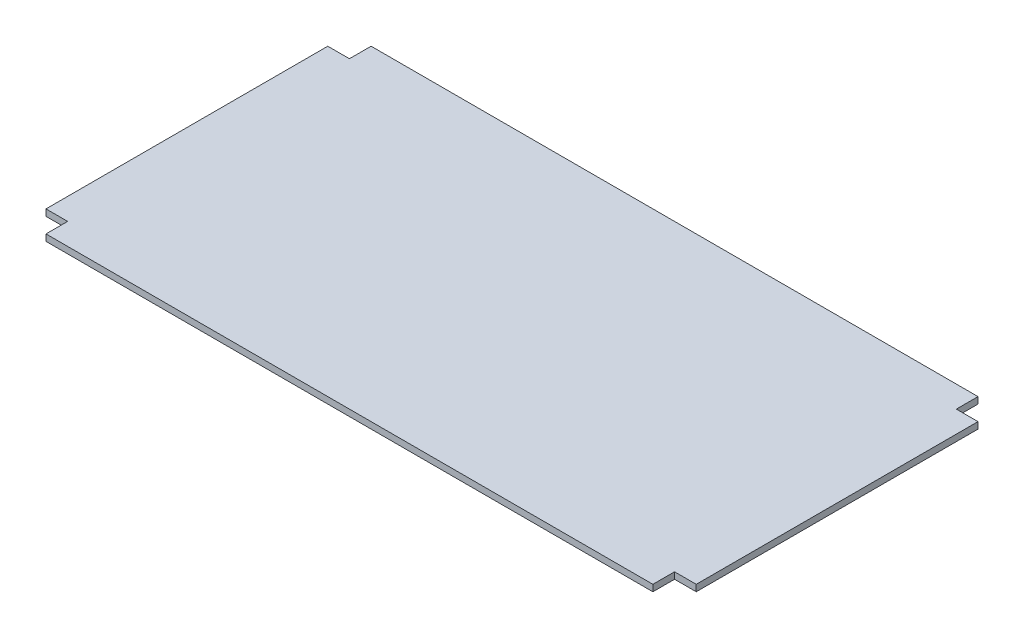
ISO-10303-21;
HEADER;
FILE_DESCRIPTION(('STEP AP214'),'2;1');
FILE_NAME('part.step','',(''),(''),'','','');
FILE_SCHEMA(('AUTOMOTIVE_DESIGN { 1 0 10303 214 1 1 1 1 }'));
ENDSEC;
DATA;
#1=APPLICATION_CONTEXT('core data for automotive mechanical design processes');
#2=APPLICATION_PROTOCOL_DEFINITION('international standard','automotive_design',2000,#1);
#3=PRODUCT_CONTEXT('',#1,'mechanical');
#4=PRODUCT('Part','Part','',(#3));
#5=PRODUCT_RELATED_PRODUCT_CATEGORY('part','',(#4));
#6=PRODUCT_DEFINITION_FORMATION('','',#4);
#7=PRODUCT_DEFINITION_CONTEXT('part definition',#1,'design');
#8=PRODUCT_DEFINITION('design','',#6,#7);
#9=PRODUCT_DEFINITION_SHAPE('','',#8);
#10=(LENGTH_UNIT() NAMED_UNIT(*) SI_UNIT(.MILLI.,.METRE.));
#11=(NAMED_UNIT(*) PLANE_ANGLE_UNIT() SI_UNIT($,.RADIAN.));
#12=(NAMED_UNIT(*) SI_UNIT($,.STERADIAN.) SOLID_ANGLE_UNIT());
#13=UNCERTAINTY_MEASURE_WITH_UNIT(LENGTH_MEASURE(1.E-05),#10,'distance_accuracy_value','');
#14=(GEOMETRIC_REPRESENTATION_CONTEXT(3) GLOBAL_UNCERTAINTY_ASSIGNED_CONTEXT((#13)) GLOBAL_UNIT_ASSIGNED_CONTEXT((#10,
#11,#12)) REPRESENTATION_CONTEXT('',''));
#15=CARTESIAN_POINT('',(0.,0.,0.));
#16=DIRECTION('',(0.,0.,1.));
#17=DIRECTION('',(1.,0.,0.));
#18=AXIS2_PLACEMENT_3D('',#15,#16,#17);
#19=CARTESIAN_POINT('',(0.,6.,0.));
#20=DIRECTION('',(1.,0.,0.));
#21=DIRECTION('',(0.,0.,-1.));
#22=AXIS2_PLACEMENT_3D('',#19,#20,#21);
#23=PLANE('',#22);
#24=DIRECTION('',(0.,0.,1.));
#25=VECTOR('',#24,1.);
#26=CARTESIAN_POINT('',(0.,6.,0.));
#27=LINE('',#26,#25);
#28=CARTESIAN_POINT('',(-9.60469719688014E-13,6.,-280.));
#29=VERTEX_POINT('',#28);
#30=CARTESIAN_POINT('',(0.,6.,-20.));
#31=VERTEX_POINT('',#30);
#32=EDGE_CURVE('E151',#29,#31,#27,.T.);
#33=ORIENTED_EDGE('',*,*,#32,.F.);
#34=DIRECTION('',(0.,1.,0.));
#35=VECTOR('',#34,1.);
#36=CARTESIAN_POINT('',(-9.60469719688014E-13,0.,-280.));
#37=LINE('',#36,#35);
#38=CARTESIAN_POINT('',(-9.60469719688014E-13,0.,-280.));
#39=VERTEX_POINT('',#38);
#40=EDGE_CURVE('E189',#39,#29,#37,.T.);
#41=ORIENTED_EDGE('',*,*,#40,.F.);
#42=DIRECTION('',(0.,0.,1.));
#43=VECTOR('',#42,1.);
#44=CARTESIAN_POINT('',(0.,0.,0.));
#45=LINE('',#44,#43);
#46=CARTESIAN_POINT('',(0.,0.,-20.));
#47=VERTEX_POINT('',#46);
#48=EDGE_CURVE('E153',#39,#47,#45,.T.);
#49=ORIENTED_EDGE('',*,*,#48,.T.);
#50=DIRECTION('',(0.,1.,0.));
#51=VECTOR('',#50,1.);
#52=CARTESIAN_POINT('',(0.,0.,-20.));
#53=LINE('',#52,#51);
#54=EDGE_CURVE('E157',#47,#31,#53,.T.);
#55=ORIENTED_EDGE('',*,*,#54,.T.);
#56=EDGE_LOOP('',(#33,#41,#49,#55));
#57=FACE_BOUND('',#56,.T.);
#58=ADVANCED_FACE('F38',(#57),#23,.F.);
#59=CARTESIAN_POINT('',(0.,6.,0.));
#60=DIRECTION('',(0.,0.,-1.));
#61=DIRECTION('',(-1.,0.,0.));
#62=AXIS2_PLACEMENT_3D('',#59,#60,#61);
#63=PLANE('',#62);
#64=DIRECTION('',(1.,0.,0.));
#65=VECTOR('',#64,1.);
#66=CARTESIAN_POINT('',(0.,0.,0.));
#67=LINE('',#66,#65);
#68=CARTESIAN_POINT('',(20.,0.,0.));
#69=VERTEX_POINT('',#68);
#70=CARTESIAN_POINT('',(580.,0.,0.));
#71=VERTEX_POINT('',#70);
#72=EDGE_CURVE('E149',#69,#71,#67,.T.);
#73=ORIENTED_EDGE('',*,*,#72,.T.);
#74=DIRECTION('',(0.,1.,0.));
#75=VECTOR('',#74,1.);
#76=CARTESIAN_POINT('',(580.,0.,0.));
#77=LINE('',#76,#75);
#78=CARTESIAN_POINT('',(580.,6.,0.));
#79=VERTEX_POINT('',#78);
#80=EDGE_CURVE('E178',#71,#79,#77,.T.);
#81=ORIENTED_EDGE('',*,*,#80,.T.);
#82=DIRECTION('',(1.,0.,0.));
#83=VECTOR('',#82,1.);
#84=CARTESIAN_POINT('',(0.,6.,0.));
#85=LINE('',#84,#83);
#86=CARTESIAN_POINT('',(20.,6.,0.));
#87=VERTEX_POINT('',#86);
#88=EDGE_CURVE('E160',#87,#79,#85,.T.);
#89=ORIENTED_EDGE('',*,*,#88,.F.);
#90=DIRECTION('',(0.,1.,0.));
#91=VECTOR('',#90,1.);
#92=CARTESIAN_POINT('',(20.,0.,0.));
#93=LINE('',#92,#91);
#94=EDGE_CURVE('E165',#69,#87,#93,.T.);
#95=ORIENTED_EDGE('',*,*,#94,.F.);
#96=EDGE_LOOP('',(#73,#81,#89,#95));
#97=FACE_BOUND('',#96,.T.);
#98=ADVANCED_FACE('F223',(#97),#63,.F.);
#99=CARTESIAN_POINT('',(600.,6.,0.));
#100=DIRECTION('',(-1.,0.,0.));
#101=DIRECTION('',(0.,0.,1.));
#102=AXIS2_PLACEMENT_3D('',#99,#100,#101);
#103=PLANE('',#102);
#104=DIRECTION('',(0.,0.,-1.));
#105=VECTOR('',#104,1.);
#106=CARTESIAN_POINT('',(600.,0.,0.));
#107=LINE('',#106,#105);
#108=CARTESIAN_POINT('',(600.,0.,-20.));
#109=VERTEX_POINT('',#108);
#110=CARTESIAN_POINT('',(599.999999999999,0.,-280.));
#111=VERTEX_POINT('',#110);
#112=EDGE_CURVE('E143',#109,#111,#107,.T.);
#113=ORIENTED_EDGE('',*,*,#112,.T.);
#114=DIRECTION('',(0.,1.,0.));
#115=VECTOR('',#114,1.);
#116=CARTESIAN_POINT('',(599.999999999999,0.,-280.));
#117=LINE('',#116,#115);
#118=CARTESIAN_POINT('',(599.999999999999,6.,-280.));
#119=VERTEX_POINT('',#118);
#120=EDGE_CURVE('E201',#111,#119,#117,.T.);
#121=ORIENTED_EDGE('',*,*,#120,.T.);
#122=DIRECTION('',(0.,0.,-1.));
#123=VECTOR('',#122,1.);
#124=CARTESIAN_POINT('',(600.,6.,0.));
#125=LINE('',#124,#123);
#126=CARTESIAN_POINT('',(600.,6.,-20.));
#127=VERTEX_POINT('',#126);
#128=EDGE_CURVE('E46',#127,#119,#125,.T.);
#129=ORIENTED_EDGE('',*,*,#128,.F.);
#130=DIRECTION('',(0.,1.,0.));
#131=VECTOR('',#130,1.);
#132=CARTESIAN_POINT('',(600.,0.,-20.));
#133=LINE('',#132,#131);
#134=EDGE_CURVE('E131',#109,#127,#133,.T.);
#135=ORIENTED_EDGE('',*,*,#134,.F.);
#136=EDGE_LOOP('',(#113,#121,#129,#135));
#137=FACE_BOUND('',#136,.T.);
#138=ADVANCED_FACE('F141',(#137),#103,.F.);
#139=CARTESIAN_POINT('',(0.,6.,-300.));
#140=DIRECTION('',(0.,0.,1.));
#141=DIRECTION('',(1.,0.,0.));
#142=AXIS2_PLACEMENT_3D('',#139,#140,#141);
#143=PLANE('',#142);
#144=DIRECTION('',(-1.,0.,0.));
#145=VECTOR('',#144,1.);
#146=CARTESIAN_POINT('',(0.,0.,-300.));
#147=LINE('',#146,#145);
#148=CARTESIAN_POINT('',(579.999999999999,0.,-300.));
#149=VERTEX_POINT('',#148);
#150=CARTESIAN_POINT('',(19.999999999999,0.,-300.));
#151=VERTEX_POINT('',#150);
#152=EDGE_CURVE('E41',#149,#151,#147,.T.);
#153=ORIENTED_EDGE('',*,*,#152,.T.);
#154=DIRECTION('',(0.,1.,0.));
#155=VECTOR('',#154,1.);
#156=CARTESIAN_POINT('',(19.999999999999,0.,-300.));
#157=LINE('',#156,#155);
#158=CARTESIAN_POINT('',(19.999999999999,6.,-300.));
#159=VERTEX_POINT('',#158);
#160=EDGE_CURVE('E185',#151,#159,#157,.T.);
#161=ORIENTED_EDGE('',*,*,#160,.T.);
#162=DIRECTION('',(-1.,0.,0.));
#163=VECTOR('',#162,1.);
#164=CARTESIAN_POINT('',(0.,6.,-300.));
#165=LINE('',#164,#163);
#166=CARTESIAN_POINT('',(579.999999999999,6.,-300.));
#167=VERTEX_POINT('',#166);
#168=EDGE_CURVE('E11',#167,#159,#165,.T.);
#169=ORIENTED_EDGE('',*,*,#168,.F.);
#170=DIRECTION('',(0.,1.,0.));
#171=VECTOR('',#170,1.);
#172=CARTESIAN_POINT('',(579.999999999999,0.,-300.));
#173=LINE('',#172,#171);
#174=EDGE_CURVE('E203',#149,#167,#173,.T.);
#175=ORIENTED_EDGE('',*,*,#174,.F.);
#176=EDGE_LOOP('',(#153,#161,#169,#175));
#177=FACE_BOUND('',#176,.T.);
#178=ADVANCED_FACE('F249',(#177),#143,.F.);
#179=CARTESIAN_POINT('',(0.,6.,0.));
#180=DIRECTION('',(0.,-1.,0.));
#181=DIRECTION('',(0.,0.,-1.));
#182=AXIS2_PLACEMENT_3D('',#179,#180,#181);
#183=PLANE('',#182);
#184=DIRECTION('',(0.,0.,-1.));
#185=VECTOR('',#184,1.);
#186=CARTESIAN_POINT('',(19.9999999999991,6.,-280.));
#187=LINE('',#186,#185);
#188=CARTESIAN_POINT('',(19.9999999999991,6.,-280.));
#189=VERTEX_POINT('',#188);
#190=EDGE_CURVE('E192',#189,#159,#187,.T.);
#191=ORIENTED_EDGE('',*,*,#190,.F.);
#192=DIRECTION('',(1.,0.,0.));
#193=VECTOR('',#192,1.);
#194=CARTESIAN_POINT('',(-9.60469719688014E-13,6.,-280.));
#195=LINE('',#194,#193);
#196=EDGE_CURVE('E195',#29,#189,#195,.T.);
#197=ORIENTED_EDGE('',*,*,#196,.F.);
#198=ORIENTED_EDGE('',*,*,#32,.T.);
#199=DIRECTION('',(-1.,0.,0.));
#200=VECTOR('',#199,1.);
#201=CARTESIAN_POINT('',(0.,6.,-20.));
#202=LINE('',#201,#200);
#203=CARTESIAN_POINT('',(20.,6.,-20.));
#204=VERTEX_POINT('',#203);
#205=EDGE_CURVE('E172',#204,#31,#202,.T.);
#206=ORIENTED_EDGE('',*,*,#205,.F.);
#207=DIRECTION('',(0.,0.,-1.));
#208=VECTOR('',#207,1.);
#209=CARTESIAN_POINT('',(20.,6.,0.));
#210=LINE('',#209,#208);
#211=EDGE_CURVE('E175',#87,#204,#210,.T.);
#212=ORIENTED_EDGE('',*,*,#211,.F.);
#213=ORIENTED_EDGE('',*,*,#88,.T.);
#214=DIRECTION('',(0.,0.,1.));
#215=VECTOR('',#214,1.);
#216=CARTESIAN_POINT('',(580.,6.,0.));
#217=LINE('',#216,#215);
#218=CARTESIAN_POINT('',(580.,6.,-20.));
#219=VERTEX_POINT('',#218);
#220=EDGE_CURVE('E136',#219,#79,#217,.T.);
#221=ORIENTED_EDGE('',*,*,#220,.F.);
#222=DIRECTION('',(-1.,0.,0.));
#223=VECTOR('',#222,1.);
#224=CARTESIAN_POINT('',(580.,6.,-20.));
#225=LINE('',#224,#223);
#226=EDGE_CURVE('E208',#127,#219,#225,.T.);
#227=ORIENTED_EDGE('',*,*,#226,.F.);
#228=ORIENTED_EDGE('',*,*,#128,.T.);
#229=DIRECTION('',(1.,0.,0.));
#230=VECTOR('',#229,1.);
#231=CARTESIAN_POINT('',(579.999999999999,6.,-280.));
#232=LINE('',#231,#230);
#233=CARTESIAN_POINT('',(579.999999999999,6.,-280.));
#234=VERTEX_POINT('',#233);
#235=EDGE_CURVE('E191',#234,#119,#232,.T.);
#236=ORIENTED_EDGE('',*,*,#235,.F.);
#237=DIRECTION('',(0.,0.,1.));
#238=VECTOR('',#237,1.);
#239=CARTESIAN_POINT('',(579.999999999999,6.,-280.));
#240=LINE('',#239,#238);
#241=EDGE_CURVE('E209',#167,#234,#240,.T.);
#242=ORIENTED_EDGE('',*,*,#241,.F.);
#243=ORIENTED_EDGE('',*,*,#168,.T.);
#244=EDGE_LOOP('',(#191,#197,#198,#206,#212,#213,#221,#227,#228,#236,#242,#243));
#245=FACE_BOUND('',#244,.T.);
#246=ADVANCED_FACE('F232',(#245),#183,.F.);
#247=CARTESIAN_POINT('',(0.,0.,0.));
#248=DIRECTION('',(0.,-1.,0.));
#249=DIRECTION('',(0.,0.,-1.));
#250=AXIS2_PLACEMENT_3D('',#247,#248,#249);
#251=PLANE('',#250);
#252=DIRECTION('',(1.,0.,0.));
#253=VECTOR('',#252,1.);
#254=CARTESIAN_POINT('',(-9.60469719688014E-13,0.,-280.));
#255=LINE('',#254,#253);
#256=CARTESIAN_POINT('',(19.9999999999991,0.,-280.));
#257=VERTEX_POINT('',#256);
#258=EDGE_CURVE('E194',#39,#257,#255,.T.);
#259=ORIENTED_EDGE('',*,*,#258,.T.);
#260=DIRECTION('',(0.,0.,-1.));
#261=VECTOR('',#260,1.);
#262=CARTESIAN_POINT('',(19.9999999999991,0.,-280.));
#263=LINE('',#262,#261);
#264=EDGE_CURVE('E186',#257,#151,#263,.T.);
#265=ORIENTED_EDGE('',*,*,#264,.T.);
#266=ORIENTED_EDGE('',*,*,#152,.F.);
#267=DIRECTION('',(0.,0.,1.));
#268=VECTOR('',#267,1.);
#269=CARTESIAN_POINT('',(579.999999999999,0.,-280.));
#270=LINE('',#269,#268);
#271=CARTESIAN_POINT('',(579.999999999999,0.,-280.));
#272=VERTEX_POINT('',#271);
#273=EDGE_CURVE('E204',#149,#272,#270,.T.);
#274=ORIENTED_EDGE('',*,*,#273,.T.);
#275=DIRECTION('',(1.,0.,0.));
#276=VECTOR('',#275,1.);
#277=CARTESIAN_POINT('',(579.999999999999,0.,-280.));
#278=LINE('',#277,#276);
#279=EDGE_CURVE('E54',#272,#111,#278,.T.);
#280=ORIENTED_EDGE('',*,*,#279,.T.);
#281=ORIENTED_EDGE('',*,*,#112,.F.);
#282=DIRECTION('',(-1.,0.,0.));
#283=VECTOR('',#282,1.);
#284=CARTESIAN_POINT('',(580.,0.,-20.));
#285=LINE('',#284,#283);
#286=CARTESIAN_POINT('',(580.,0.,-20.));
#287=VERTEX_POINT('',#286);
#288=EDGE_CURVE('E127',#109,#287,#285,.T.);
#289=ORIENTED_EDGE('',*,*,#288,.T.);
#290=DIRECTION('',(0.,0.,1.));
#291=VECTOR('',#290,1.);
#292=CARTESIAN_POINT('',(580.,0.,0.));
#293=LINE('',#292,#291);
#294=EDGE_CURVE('E62',#287,#71,#293,.T.);
#295=ORIENTED_EDGE('',*,*,#294,.T.);
#296=ORIENTED_EDGE('',*,*,#72,.F.);
#297=DIRECTION('',(0.,0.,-1.));
#298=VECTOR('',#297,1.);
#299=CARTESIAN_POINT('',(20.,0.,0.));
#300=LINE('',#299,#298);
#301=CARTESIAN_POINT('',(20.,0.,-20.));
#302=VERTEX_POINT('',#301);
#303=EDGE_CURVE('E174',#69,#302,#300,.T.);
#304=ORIENTED_EDGE('',*,*,#303,.T.);
#305=DIRECTION('',(-1.,0.,0.));
#306=VECTOR('',#305,1.);
#307=CARTESIAN_POINT('',(0.,0.,-20.));
#308=LINE('',#307,#306);
#309=EDGE_CURVE('E168',#302,#47,#308,.T.);
#310=ORIENTED_EDGE('',*,*,#309,.T.);
#311=ORIENTED_EDGE('',*,*,#48,.F.);
#312=EDGE_LOOP('',(#259,#265,#266,#274,#280,#281,#289,#295,#296,#304,#310,#311));
#313=FACE_BOUND('',#312,.T.);
#314=ADVANCED_FACE('F147',(#313),#251,.T.);
#315=CARTESIAN_POINT('',(0.,0.,-20.));
#316=DIRECTION('',(0.,0.,-1.));
#317=DIRECTION('',(-1.,0.,0.));
#318=AXIS2_PLACEMENT_3D('',#315,#316,#317);
#319=PLANE('',#318);
#320=ORIENTED_EDGE('',*,*,#205,.T.);
#321=ORIENTED_EDGE('',*,*,#54,.F.);
#322=ORIENTED_EDGE('',*,*,#309,.F.);
#323=DIRECTION('',(0.,1.,0.));
#324=VECTOR('',#323,1.);
#325=CARTESIAN_POINT('',(20.,0.,-20.));
#326=LINE('',#325,#324);
#327=EDGE_CURVE('E167',#302,#204,#326,.T.);
#328=ORIENTED_EDGE('',*,*,#327,.T.);
#329=EDGE_LOOP('',(#320,#321,#322,#328));
#330=FACE_BOUND('',#329,.T.);
#331=ADVANCED_FACE('F237',(#330),#319,.F.);
#332=CARTESIAN_POINT('',(20.,0.,0.));
#333=DIRECTION('',(1.,0.,0.));
#334=DIRECTION('',(0.,0.,-1.));
#335=AXIS2_PLACEMENT_3D('',#332,#333,#334);
#336=PLANE('',#335);
#337=ORIENTED_EDGE('',*,*,#211,.T.);
#338=ORIENTED_EDGE('',*,*,#327,.F.);
#339=ORIENTED_EDGE('',*,*,#303,.F.);
#340=ORIENTED_EDGE('',*,*,#94,.T.);
#341=EDGE_LOOP('',(#337,#338,#339,#340));
#342=FACE_BOUND('',#341,.T.);
#343=ADVANCED_FACE('F227',(#342),#336,.F.);
#344=CARTESIAN_POINT('',(580.,0.,0.));
#345=DIRECTION('',(-1.,0.,0.));
#346=DIRECTION('',(0.,0.,1.));
#347=AXIS2_PLACEMENT_3D('',#344,#345,#346);
#348=PLANE('',#347);
#349=ORIENTED_EDGE('',*,*,#220,.T.);
#350=ORIENTED_EDGE('',*,*,#80,.F.);
#351=ORIENTED_EDGE('',*,*,#294,.F.);
#352=DIRECTION('',(0.,1.,0.));
#353=VECTOR('',#352,1.);
#354=CARTESIAN_POINT('',(580.,0.,-20.));
#355=LINE('',#354,#353);
#356=EDGE_CURVE('E133',#287,#219,#355,.T.);
#357=ORIENTED_EDGE('',*,*,#356,.T.);
#358=EDGE_LOOP('',(#349,#350,#351,#357));
#359=FACE_BOUND('',#358,.T.);
#360=ADVANCED_FACE('F256',(#359),#348,.F.);
#361=CARTESIAN_POINT('',(580.,0.,-20.));
#362=DIRECTION('',(0.,0.,-1.));
#363=DIRECTION('',(-1.,0.,0.));
#364=AXIS2_PLACEMENT_3D('',#361,#362,#363);
#365=PLANE('',#364);
#366=ORIENTED_EDGE('',*,*,#226,.T.);
#367=ORIENTED_EDGE('',*,*,#356,.F.);
#368=ORIENTED_EDGE('',*,*,#288,.F.);
#369=ORIENTED_EDGE('',*,*,#134,.T.);
#370=EDGE_LOOP('',(#366,#367,#368,#369));
#371=FACE_BOUND('',#370,.T.);
#372=ADVANCED_FACE('F130',(#371),#365,.F.);
#373=CARTESIAN_POINT('',(579.999999999999,0.,-280.));
#374=DIRECTION('',(0.,0.,1.));
#375=DIRECTION('',(1.,0.,0.));
#376=AXIS2_PLACEMENT_3D('',#373,#374,#375);
#377=PLANE('',#376);
#378=ORIENTED_EDGE('',*,*,#235,.T.);
#379=ORIENTED_EDGE('',*,*,#120,.F.);
#380=ORIENTED_EDGE('',*,*,#279,.F.);
#381=DIRECTION('',(0.,1.,0.));
#382=VECTOR('',#381,1.);
#383=CARTESIAN_POINT('',(579.999999999999,0.,-280.));
#384=LINE('',#383,#382);
#385=EDGE_CURVE('E206',#272,#234,#384,.T.);
#386=ORIENTED_EDGE('',*,*,#385,.T.);
#387=EDGE_LOOP('',(#378,#379,#380,#386));
#388=FACE_BOUND('',#387,.T.);
#389=ADVANCED_FACE('F255',(#388),#377,.F.);
#390=CARTESIAN_POINT('',(579.999999999999,0.,-280.));
#391=DIRECTION('',(-1.,0.,0.));
#392=DIRECTION('',(0.,0.,1.));
#393=AXIS2_PLACEMENT_3D('',#390,#391,#392);
#394=PLANE('',#393);
#395=ORIENTED_EDGE('',*,*,#241,.T.);
#396=ORIENTED_EDGE('',*,*,#385,.F.);
#397=ORIENTED_EDGE('',*,*,#273,.F.);
#398=ORIENTED_EDGE('',*,*,#174,.T.);
#399=EDGE_LOOP('',(#395,#396,#397,#398));
#400=FACE_BOUND('',#399,.T.);
#401=ADVANCED_FACE('F254',(#400),#394,.F.);
#402=CARTESIAN_POINT('',(-9.60469719688014E-13,0.,-280.));
#403=DIRECTION('',(0.,0.,1.));
#404=DIRECTION('',(1.,0.,0.));
#405=AXIS2_PLACEMENT_3D('',#402,#403,#404);
#406=PLANE('',#405);
#407=ORIENTED_EDGE('',*,*,#196,.T.);
#408=DIRECTION('',(0.,1.,0.));
#409=VECTOR('',#408,1.);
#410=CARTESIAN_POINT('',(19.9999999999991,0.,-280.));
#411=LINE('',#410,#409);
#412=EDGE_CURVE('E183',#257,#189,#411,.T.);
#413=ORIENTED_EDGE('',*,*,#412,.F.);
#414=ORIENTED_EDGE('',*,*,#258,.F.);
#415=ORIENTED_EDGE('',*,*,#40,.T.);
#416=EDGE_LOOP('',(#407,#413,#414,#415));
#417=FACE_BOUND('',#416,.T.);
#418=ADVANCED_FACE('F244',(#417),#406,.F.);
#419=CARTESIAN_POINT('',(19.9999999999991,0.,-280.));
#420=DIRECTION('',(1.,0.,0.));
#421=DIRECTION('',(0.,0.,-1.));
#422=AXIS2_PLACEMENT_3D('',#419,#420,#421);
#423=PLANE('',#422);
#424=ORIENTED_EDGE('',*,*,#190,.T.);
#425=ORIENTED_EDGE('',*,*,#160,.F.);
#426=ORIENTED_EDGE('',*,*,#264,.F.);
#427=ORIENTED_EDGE('',*,*,#412,.T.);
#428=EDGE_LOOP('',(#424,#425,#426,#427));
#429=FACE_BOUND('',#428,.T.);
#430=ADVANCED_FACE('F246',(#429),#423,.F.);
#431=CLOSED_SHELL('',(#58,#98,#138,#178,#246,#314,#331,#343,#360,#372,#389,#401,#418,#430));
#432=MANIFOLD_SOLID_BREP('B2',#431);
#433=ADVANCED_BREP_SHAPE_REPRESENTATION('',(#18,#432),#14);
#434=SHAPE_DEFINITION_REPRESENTATION(#9,#433);
ENDSEC;
END-ISO-10303-21;
